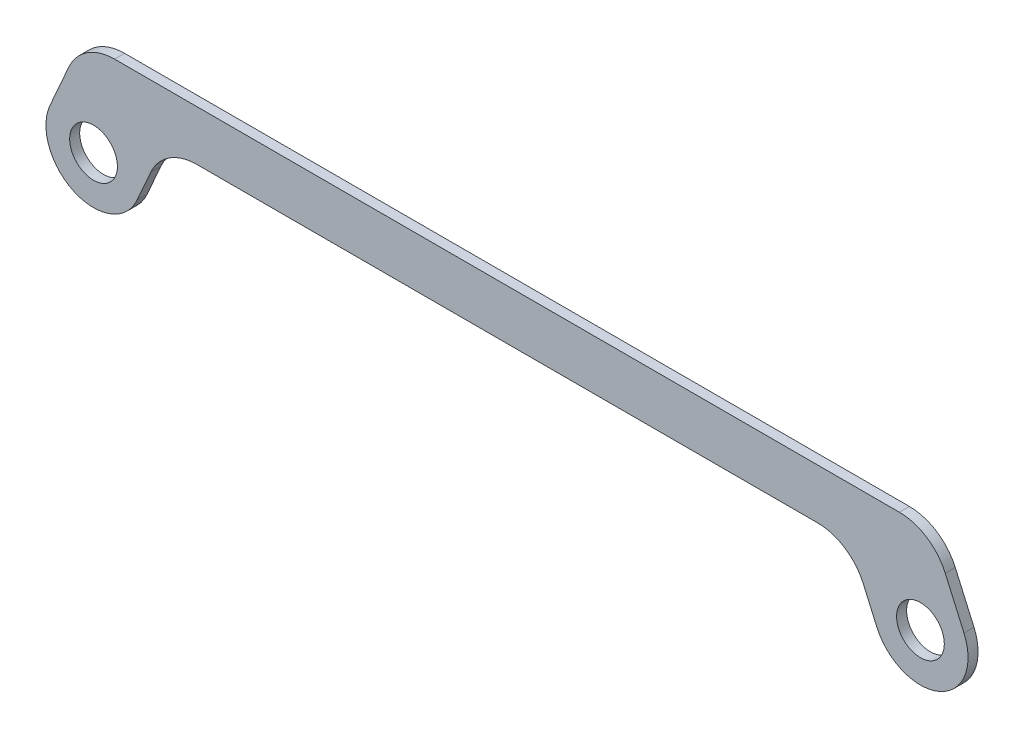
ISO-10303-21;
HEADER;
FILE_DESCRIPTION(('STEP AP214'),'2;1');
FILE_NAME('part.step','',(''),(''),'','','');
FILE_SCHEMA(('AUTOMOTIVE_DESIGN { 1 0 10303 214 1 1 1 1 }'));
ENDSEC;
DATA;
#1=APPLICATION_CONTEXT('core data for automotive mechanical design processes');
#2=APPLICATION_PROTOCOL_DEFINITION('international standard','automotive_design',2000,#1);
#3=PRODUCT_CONTEXT('',#1,'mechanical');
#4=PRODUCT('Part','Part','',(#3));
#5=PRODUCT_RELATED_PRODUCT_CATEGORY('part','',(#4));
#6=PRODUCT_DEFINITION_FORMATION('','',#4);
#7=PRODUCT_DEFINITION_CONTEXT('part definition',#1,'design');
#8=PRODUCT_DEFINITION('design','',#6,#7);
#9=PRODUCT_DEFINITION_SHAPE('','',#8);
#10=(LENGTH_UNIT() NAMED_UNIT(*) SI_UNIT(.MILLI.,.METRE.));
#11=(NAMED_UNIT(*) PLANE_ANGLE_UNIT() SI_UNIT($,.RADIAN.));
#12=(NAMED_UNIT(*) SI_UNIT($,.STERADIAN.) SOLID_ANGLE_UNIT());
#13=UNCERTAINTY_MEASURE_WITH_UNIT(LENGTH_MEASURE(1.E-05),#10,'distance_accuracy_value','');
#14=(GEOMETRIC_REPRESENTATION_CONTEXT(3) GLOBAL_UNCERTAINTY_ASSIGNED_CONTEXT((#13)) GLOBAL_UNIT_ASSIGNED_CONTEXT((#10,
#11,#12)) REPRESENTATION_CONTEXT('',''));
#15=CARTESIAN_POINT('',(0.,0.,0.));
#16=DIRECTION('',(0.,0.,1.));
#17=DIRECTION('',(1.,0.,0.));
#18=AXIS2_PLACEMENT_3D('',#15,#16,#17);
#19=CARTESIAN_POINT('',(0.,0.,4.));
#20=DIRECTION('',(0.,0.,-1.));
#21=DIRECTION('',(-1.,0.,0.));
#22=AXIS2_PLACEMENT_3D('',#19,#20,#21);
#23=PLANE('',#22);
#24=DIRECTION('',(-0.403699080087145,0.914891825702248,0.));
#25=VECTOR('',#24,1.);
#26=CARTESIAN_POINT('',(347.382944688343,7.67028252165581,4.));
#27=LINE('',#26,#25);
#28=CARTESIAN_POINT('',(347.382944688343,7.67028252165581,4.));
#29=VERTEX_POINT('',#28);
#30=CARTESIAN_POINT('',(339.902023752577,24.624082395016,4.));
#31=VERTEX_POINT('',#30);
#32=EDGE_CURVE('E205',#29,#31,#27,.T.);
#33=ORIENTED_EDGE('',*,*,#32,.T.);
#34=CARTESIAN_POINT('',(321.604187238532,16.5501007932731,4.));
#35=DIRECTION('',(0.,0.,-1.));
#36=DIRECTION('',(-1.,0.,0.));
#37=AXIS2_PLACEMENT_3D('',#34,#35,#36);
#38=CIRCLE('',#37,20.);
#39=CARTESIAN_POINT('',(321.604187238532,36.5501007932731,4.));
#40=VERTEX_POINT('',#39);
#41=EDGE_CURVE('E172',#31,#40,#38,.F.);
#42=ORIENTED_EDGE('',*,*,#41,.T.);
#43=DIRECTION('',(-1.,0.,0.));
#44=VECTOR('',#43,1.);
#45=CARTESIAN_POINT('',(-4.63962821987729,36.5501007932731,4.));
#46=LINE('',#45,#44);
#47=CARTESIAN_POINT('',(8.3958127614682,36.5501007932731,4.));
#48=VERTEX_POINT('',#47);
#49=EDGE_CURVE('E207',#40,#48,#46,.T.);
#50=ORIENTED_EDGE('',*,*,#49,.T.);
#51=CARTESIAN_POINT('',(8.3958127614682,16.5501007932731,4.));
#52=DIRECTION('',(0.,0.,-1.));
#53=DIRECTION('',(-1.,0.,0.));
#54=AXIS2_PLACEMENT_3D('',#51,#52,#53);
#55=CIRCLE('',#54,20.);
#56=CARTESIAN_POINT('',(-9.90202375257675,24.624082395016,4.));
#57=VERTEX_POINT('',#56);
#58=EDGE_CURVE('E50',#48,#57,#55,.F.);
#59=ORIENTED_EDGE('',*,*,#58,.T.);
#60=DIRECTION('',(-0.403699080087146,-0.914891825702248,0.));
#61=VECTOR('',#60,1.);
#62=CARTESIAN_POINT('',(-17.3829446883427,7.67028252165577,4.));
#63=LINE('',#62,#61);
#64=CARTESIAN_POINT('',(-17.3829446883427,7.67028252165577,4.));
#65=VERTEX_POINT('',#64);
#66=EDGE_CURVE('E136',#57,#65,#63,.T.);
#67=ORIENTED_EDGE('',*,*,#66,.T.);
#68=CARTESIAN_POINT('',(0.,0.,4.));
#69=DIRECTION('',(0.,0.,1.));
#70=DIRECTION('',(-1.,0.,0.));
#71=AXIS2_PLACEMENT_3D('',#68,#69,#70);
#72=CIRCLE('',#71,19.);
#73=CARTESIAN_POINT('',(17.3829446883427,-7.67028252165576,4.));
#74=VERTEX_POINT('',#73);
#75=EDGE_CURVE('E131',#65,#74,#72,.T.);
#76=ORIENTED_EDGE('',*,*,#75,.T.);
#77=DIRECTION('',(0.403699080087146,0.914891825702248,0.));
#78=VECTOR('',#77,1.);
#79=CARTESIAN_POINT('',(17.3829446883427,-7.67028252165576,4.));
#80=LINE('',#79,#78);
#81=CARTESIAN_POINT('',(22.8078743550893,4.62408239501599,4.));
#82=VERTEX_POINT('',#81);
#83=EDGE_CURVE('E123',#74,#82,#80,.T.);
#84=ORIENTED_EDGE('',*,*,#83,.T.);
#85=CARTESIAN_POINT('',(41.1057108691342,-3.44989920672692,4.));
#86=DIRECTION('',(0.,0.,-1.));
#87=DIRECTION('',(-1.,0.,0.));
#88=AXIS2_PLACEMENT_3D('',#85,#86,#87);
#89=CIRCLE('',#88,20.);
#90=CARTESIAN_POINT('',(41.1057108691342,16.5501007932731,4.));
#91=VERTEX_POINT('',#90);
#92=EDGE_CURVE('E11',#82,#91,#89,.T.);
#93=ORIENTED_EDGE('',*,*,#92,.T.);
#94=DIRECTION('',(1.,0.,0.));
#95=VECTOR('',#94,1.);
#96=CARTESIAN_POINT('',(28.0702698877887,16.5501007932731,4.));
#97=LINE('',#96,#95);
#98=CARTESIAN_POINT('',(288.894289130866,16.5501007932731,4.));
#99=VERTEX_POINT('',#98);
#100=EDGE_CURVE('E130',#91,#99,#97,.T.);
#101=ORIENTED_EDGE('',*,*,#100,.T.);
#102=CARTESIAN_POINT('',(288.894289130866,-3.44989920672689,4.));
#103=DIRECTION('',(0.,0.,-1.));
#104=DIRECTION('',(-1.,0.,0.));
#105=AXIS2_PLACEMENT_3D('',#102,#103,#104);
#106=CIRCLE('',#105,20.);
#107=CARTESIAN_POINT('',(307.192125644911,4.62408239501602,4.));
#108=VERTEX_POINT('',#107);
#109=EDGE_CURVE('E180',#99,#108,#106,.T.);
#110=ORIENTED_EDGE('',*,*,#109,.T.);
#111=DIRECTION('',(0.403699080087146,-0.914891825702248,0.));
#112=VECTOR('',#111,1.);
#113=CARTESIAN_POINT('',(312.617055311657,-7.67028252165573,4.));
#114=LINE('',#113,#112);
#115=CARTESIAN_POINT('',(312.617055311657,-7.67028252165574,4.));
#116=VERTEX_POINT('',#115);
#117=EDGE_CURVE('E199',#108,#116,#114,.T.);
#118=ORIENTED_EDGE('',*,*,#117,.T.);
#119=CARTESIAN_POINT('',(330.,0.,4.));
#120=DIRECTION('',(0.,0.,1.));
#121=DIRECTION('',(1.,0.,0.));
#122=AXIS2_PLACEMENT_3D('',#119,#120,#121);
#123=CIRCLE('',#122,19.);
#124=EDGE_CURVE('E201',#116,#29,#123,.T.);
#125=ORIENTED_EDGE('',*,*,#124,.T.);
#126=EDGE_LOOP('',(#33,#42,#50,#59,#67,#76,#84,#93,#101,#110,#118,#125));
#127=FACE_BOUND('',#126,.T.);
#128=CARTESIAN_POINT('',(0.,0.,4.));
#129=DIRECTION('',(0.,0.,1.));
#130=DIRECTION('',(1.,0.,0.));
#131=AXIS2_PLACEMENT_3D('',#128,#129,#130);
#132=CIRCLE('',#131,9.525);
#133=CARTESIAN_POINT('',(9.525,0.,4.));
#134=VERTEX_POINT('',#133);
#135=EDGE_CURVE('E211',#134,#134,#132,.T.);
#136=ORIENTED_EDGE('',*,*,#135,.F.);
#137=EDGE_LOOP('',(#136));
#138=FACE_BOUND('',#137,.T.);
#139=CARTESIAN_POINT('',(330.,0.,4.));
#140=DIRECTION('',(0.,0.,1.));
#141=DIRECTION('',(1.,0.,0.));
#142=AXIS2_PLACEMENT_3D('',#139,#140,#141);
#143=CIRCLE('',#142,9.52500000000002);
#144=CARTESIAN_POINT('',(339.525,0.,4.));
#145=VERTEX_POINT('',#144);
#146=EDGE_CURVE('E279',#145,#145,#143,.T.);
#147=ORIENTED_EDGE('',*,*,#146,.F.);
#148=EDGE_LOOP('',(#147));
#149=FACE_BOUND('',#148,.T.);
#150=ADVANCED_FACE('F35',(#127,#138,#149),#23,.F.);
#151=CARTESIAN_POINT('',(0.,0.,0.));
#152=DIRECTION('',(0.,0.,-1.));
#153=DIRECTION('',(-1.,0.,0.));
#154=AXIS2_PLACEMENT_3D('',#151,#152,#153);
#155=PLANE('',#154);
#156=CARTESIAN_POINT('',(0.,0.,0.));
#157=DIRECTION('',(0.,0.,1.));
#158=DIRECTION('',(1.,0.,0.));
#159=AXIS2_PLACEMENT_3D('',#156,#157,#158);
#160=CIRCLE('',#159,9.525);
#161=CARTESIAN_POINT('',(9.525,0.,0.));
#162=VERTEX_POINT('',#161);
#163=EDGE_CURVE('E284',#162,#162,#160,.T.);
#164=ORIENTED_EDGE('',*,*,#163,.T.);
#165=EDGE_LOOP('',(#164));
#166=FACE_BOUND('',#165,.T.);
#167=DIRECTION('',(-1.,0.,0.));
#168=VECTOR('',#167,1.);
#169=CARTESIAN_POINT('',(-4.63962821987729,36.5501007932731,0.));
#170=LINE('',#169,#168);
#171=CARTESIAN_POINT('',(321.604187238532,36.5501007932731,0.));
#172=VERTEX_POINT('',#171);
#173=CARTESIAN_POINT('',(8.3958127614682,36.5501007932731,0.));
#174=VERTEX_POINT('',#173);
#175=EDGE_CURVE('E221',#172,#174,#170,.T.);
#176=ORIENTED_EDGE('',*,*,#175,.F.);
#177=CARTESIAN_POINT('',(321.604187238532,16.5501007932731,0.));
#178=DIRECTION('',(0.,0.,-1.));
#179=DIRECTION('',(-1.,0.,0.));
#180=AXIS2_PLACEMENT_3D('',#177,#178,#179);
#181=CIRCLE('',#180,20.);
#182=CARTESIAN_POINT('',(339.902023752577,24.624082395016,0.));
#183=VERTEX_POINT('',#182);
#184=EDGE_CURVE('E167',#172,#183,#181,.T.);
#185=ORIENTED_EDGE('',*,*,#184,.T.);
#186=DIRECTION('',(-0.403699080087145,0.914891825702248,0.));
#187=VECTOR('',#186,1.);
#188=CARTESIAN_POINT('',(347.382944688343,7.67028252165581,0.));
#189=LINE('',#188,#187);
#190=CARTESIAN_POINT('',(347.382944688343,7.67028252165581,0.));
#191=VERTEX_POINT('',#190);
#192=EDGE_CURVE('E218',#191,#183,#189,.T.);
#193=ORIENTED_EDGE('',*,*,#192,.F.);
#194=CARTESIAN_POINT('',(330.,0.,0.));
#195=DIRECTION('',(0.,0.,1.));
#196=DIRECTION('',(1.,0.,0.));
#197=AXIS2_PLACEMENT_3D('',#194,#195,#196);
#198=CIRCLE('',#197,19.);
#199=CARTESIAN_POINT('',(312.617055311657,-7.67028252165574,0.));
#200=VERTEX_POINT('',#199);
#201=EDGE_CURVE('E216',#200,#191,#198,.T.);
#202=ORIENTED_EDGE('',*,*,#201,.F.);
#203=DIRECTION('',(0.403699080087146,-0.914891825702248,0.));
#204=VECTOR('',#203,1.);
#205=CARTESIAN_POINT('',(312.617055311657,-7.67028252165573,0.));
#206=LINE('',#205,#204);
#207=CARTESIAN_POINT('',(307.192125644911,4.62408239501602,0.));
#208=VERTEX_POINT('',#207);
#209=EDGE_CURVE('E214',#208,#200,#206,.T.);
#210=ORIENTED_EDGE('',*,*,#209,.F.);
#211=CARTESIAN_POINT('',(288.894289130866,-3.44989920672689,0.));
#212=DIRECTION('',(0.,0.,-1.));
#213=DIRECTION('',(-1.,0.,0.));
#214=AXIS2_PLACEMENT_3D('',#211,#212,#213);
#215=CIRCLE('',#214,20.);
#216=CARTESIAN_POINT('',(288.894289130866,16.5501007932731,0.));
#217=VERTEX_POINT('',#216);
#218=EDGE_CURVE('E178',#208,#217,#215,.F.);
#219=ORIENTED_EDGE('',*,*,#218,.T.);
#220=DIRECTION('',(1.,0.,0.));
#221=VECTOR('',#220,1.);
#222=CARTESIAN_POINT('',(28.0702698877887,16.5501007932731,0.));
#223=LINE('',#222,#221);
#224=CARTESIAN_POINT('',(41.1057108691342,16.5501007932731,0.));
#225=VERTEX_POINT('',#224);
#226=EDGE_CURVE('E188',#225,#217,#223,.T.);
#227=ORIENTED_EDGE('',*,*,#226,.F.);
#228=CARTESIAN_POINT('',(41.1057108691342,-3.44989920672692,0.));
#229=DIRECTION('',(0.,0.,-1.));
#230=DIRECTION('',(-1.,0.,0.));
#231=AXIS2_PLACEMENT_3D('',#228,#229,#230);
#232=CIRCLE('',#231,20.);
#233=CARTESIAN_POINT('',(22.8078743550893,4.62408239501599,0.));
#234=VERTEX_POINT('',#233);
#235=EDGE_CURVE('E43',#225,#234,#232,.F.);
#236=ORIENTED_EDGE('',*,*,#235,.T.);
#237=DIRECTION('',(0.403699080087146,0.914891825702248,0.));
#238=VECTOR('',#237,1.);
#239=CARTESIAN_POINT('',(17.3829446883427,-7.67028252165576,0.));
#240=LINE('',#239,#238);
#241=CARTESIAN_POINT('',(17.3829446883427,-7.67028252165576,0.));
#242=VERTEX_POINT('',#241);
#243=EDGE_CURVE('E186',#242,#234,#240,.T.);
#244=ORIENTED_EDGE('',*,*,#243,.F.);
#245=CARTESIAN_POINT('',(0.,0.,0.));
#246=DIRECTION('',(0.,0.,1.));
#247=DIRECTION('',(-1.,0.,0.));
#248=AXIS2_PLACEMENT_3D('',#245,#246,#247);
#249=CIRCLE('',#248,19.);
#250=CARTESIAN_POINT('',(-17.3829446883427,7.67028252165577,0.));
#251=VERTEX_POINT('',#250);
#252=EDGE_CURVE('E144',#251,#242,#249,.T.);
#253=ORIENTED_EDGE('',*,*,#252,.F.);
#254=DIRECTION('',(-0.403699080087146,-0.914891825702248,0.));
#255=VECTOR('',#254,1.);
#256=CARTESIAN_POINT('',(-17.3829446883427,7.67028252165577,0.));
#257=LINE('',#256,#255);
#258=CARTESIAN_POINT('',(-9.90202375257675,24.624082395016,0.));
#259=VERTEX_POINT('',#258);
#260=EDGE_CURVE('E140',#259,#251,#257,.T.);
#261=ORIENTED_EDGE('',*,*,#260,.F.);
#262=CARTESIAN_POINT('',(8.3958127614682,16.5501007932731,0.));
#263=DIRECTION('',(0.,0.,-1.));
#264=DIRECTION('',(-1.,0.,0.));
#265=AXIS2_PLACEMENT_3D('',#262,#263,#264);
#266=CIRCLE('',#265,20.);
#267=EDGE_CURVE('E165',#259,#174,#266,.T.);
#268=ORIENTED_EDGE('',*,*,#267,.T.);
#269=EDGE_LOOP('',(#176,#185,#193,#202,#210,#219,#227,#236,#244,#253,#261,#268));
#270=FACE_BOUND('',#269,.T.);
#271=CARTESIAN_POINT('',(330.,0.,0.));
#272=DIRECTION('',(0.,0.,1.));
#273=DIRECTION('',(1.,0.,0.));
#274=AXIS2_PLACEMENT_3D('',#271,#272,#273);
#275=CIRCLE('',#274,9.52500000000002);
#276=CARTESIAN_POINT('',(339.525,0.,0.));
#277=VERTEX_POINT('',#276);
#278=EDGE_CURVE('E282',#277,#277,#275,.T.);
#279=ORIENTED_EDGE('',*,*,#278,.T.);
#280=EDGE_LOOP('',(#279));
#281=FACE_BOUND('',#280,.T.);
#282=ADVANCED_FACE('F184',(#166,#270,#281),#155,.T.);
#283=CARTESIAN_POINT('',(0.,0.,4.));
#284=DIRECTION('',(0.,0.,-1.));
#285=DIRECTION('',(-1.,0.,0.));
#286=AXIS2_PLACEMENT_3D('',#283,#284,#285);
#287=CYLINDRICAL_SURFACE('',#286,19.);
#288=ORIENTED_EDGE('',*,*,#252,.T.);
#289=DIRECTION('',(0.,0.,-1.));
#290=VECTOR('',#289,1.);
#291=CARTESIAN_POINT('',(17.3829446883427,-7.67028252165576,4.));
#292=LINE('',#291,#290);
#293=EDGE_CURVE('E127',#74,#242,#292,.T.);
#294=ORIENTED_EDGE('',*,*,#293,.F.);
#295=ORIENTED_EDGE('',*,*,#75,.F.);
#296=DIRECTION('',(0.,0.,-1.));
#297=VECTOR('',#296,1.);
#298=CARTESIAN_POINT('',(-17.3829446883427,7.67028252165577,4.));
#299=LINE('',#298,#297);
#300=EDGE_CURVE('E210',#65,#251,#299,.T.);
#301=ORIENTED_EDGE('',*,*,#300,.T.);
#302=EDGE_LOOP('',(#288,#294,#295,#301));
#303=FACE_BOUND('',#302,.T.);
#304=ADVANCED_FACE('F142',(#303),#287,.T.);
#305=CARTESIAN_POINT('',(17.3829446883427,-7.67028252165576,4.));
#306=DIRECTION('',(-0.914891825702248,0.403699080087146,0.));
#307=DIRECTION('',(-0.403699080087146,-0.914891825702248,0.));
#308=AXIS2_PLACEMENT_3D('',#305,#306,#307);
#309=PLANE('',#308);
#310=ORIENTED_EDGE('',*,*,#243,.T.);
#311=DIRECTION('',(0.,0.,-1.));
#312=VECTOR('',#311,1.);
#313=CARTESIAN_POINT('',(22.8078743550893,4.62408239501599,4.));
#314=LINE('',#313,#312);
#315=EDGE_CURVE('E58',#234,#82,#314,.F.);
#316=ORIENTED_EDGE('',*,*,#315,.T.);
#317=ORIENTED_EDGE('',*,*,#83,.F.);
#318=ORIENTED_EDGE('',*,*,#293,.T.);
#319=EDGE_LOOP('',(#310,#316,#317,#318));
#320=FACE_BOUND('',#319,.T.);
#321=ADVANCED_FACE('F125',(#320),#309,.F.);
#322=CARTESIAN_POINT('',(28.0702698877887,16.5501007932731,4.));
#323=DIRECTION('',(0.,1.,0.));
#324=DIRECTION('',(-1.,0.,0.));
#325=AXIS2_PLACEMENT_3D('',#322,#323,#324);
#326=PLANE('',#325);
#327=ORIENTED_EDGE('',*,*,#226,.T.);
#328=DIRECTION('',(0.,0.,-1.));
#329=VECTOR('',#328,1.);
#330=CARTESIAN_POINT('',(288.894289130866,16.5501007932731,4.));
#331=LINE('',#330,#329);
#332=EDGE_CURVE('E158',#217,#99,#331,.F.);
#333=ORIENTED_EDGE('',*,*,#332,.T.);
#334=ORIENTED_EDGE('',*,*,#100,.F.);
#335=DIRECTION('',(0.,0.,-1.));
#336=VECTOR('',#335,1.);
#337=CARTESIAN_POINT('',(41.1057108691342,16.5501007932731,0.));
#338=LINE('',#337,#336);
#339=EDGE_CURVE('E149',#91,#225,#338,.T.);
#340=ORIENTED_EDGE('',*,*,#339,.T.);
#341=EDGE_LOOP('',(#327,#333,#334,#340));
#342=FACE_BOUND('',#341,.T.);
#343=ADVANCED_FACE('F197',(#342),#326,.F.);
#344=CARTESIAN_POINT('',(312.617055311657,-7.67028252165573,4.));
#345=DIRECTION('',(0.914891825702248,0.403699080087146,0.));
#346=DIRECTION('',(-0.403699080087146,0.914891825702248,0.));
#347=AXIS2_PLACEMENT_3D('',#344,#345,#346);
#348=PLANE('',#347);
#349=ORIENTED_EDGE('',*,*,#117,.F.);
#350=DIRECTION('',(0.,0.,-1.));
#351=VECTOR('',#350,1.);
#352=CARTESIAN_POINT('',(307.192125644911,4.62408239501603,0.));
#353=LINE('',#352,#351);
#354=EDGE_CURVE('E145',#108,#208,#353,.T.);
#355=ORIENTED_EDGE('',*,*,#354,.T.);
#356=ORIENTED_EDGE('',*,*,#209,.T.);
#357=DIRECTION('',(0.,0.,-1.));
#358=VECTOR('',#357,1.);
#359=CARTESIAN_POINT('',(312.617055311657,-7.67028252165574,4.));
#360=LINE('',#359,#358);
#361=EDGE_CURVE('E146',#116,#200,#360,.T.);
#362=ORIENTED_EDGE('',*,*,#361,.F.);
#363=EDGE_LOOP('',(#349,#355,#356,#362));
#364=FACE_BOUND('',#363,.T.);
#365=ADVANCED_FACE('F348',(#364),#348,.F.);
#366=CARTESIAN_POINT('',(330.,0.,4.));
#367=DIRECTION('',(0.,0.,-1.));
#368=DIRECTION('',(-1.,0.,0.));
#369=AXIS2_PLACEMENT_3D('',#366,#367,#368);
#370=CYLINDRICAL_SURFACE('',#369,19.);
#371=ORIENTED_EDGE('',*,*,#201,.T.);
#372=DIRECTION('',(0.,0.,-1.));
#373=VECTOR('',#372,1.);
#374=CARTESIAN_POINT('',(347.382944688343,7.67028252165581,4.));
#375=LINE('',#374,#373);
#376=EDGE_CURVE('E152',#29,#191,#375,.T.);
#377=ORIENTED_EDGE('',*,*,#376,.F.);
#378=ORIENTED_EDGE('',*,*,#124,.F.);
#379=ORIENTED_EDGE('',*,*,#361,.T.);
#380=EDGE_LOOP('',(#371,#377,#378,#379));
#381=FACE_BOUND('',#380,.T.);
#382=ADVANCED_FACE('F341',(#381),#370,.T.);
#383=CARTESIAN_POINT('',(347.382944688343,7.67028252165581,4.));
#384=DIRECTION('',(-0.914891825702248,-0.403699080087145,0.));
#385=DIRECTION('',(0.403699080087145,-0.914891825702248,0.));
#386=AXIS2_PLACEMENT_3D('',#383,#384,#385);
#387=PLANE('',#386);
#388=ORIENTED_EDGE('',*,*,#192,.T.);
#389=DIRECTION('',(0.,0.,-1.));
#390=VECTOR('',#389,1.);
#391=CARTESIAN_POINT('',(339.902023752577,24.624082395016,4.));
#392=LINE('',#391,#390);
#393=EDGE_CURVE('E169',#183,#31,#392,.F.);
#394=ORIENTED_EDGE('',*,*,#393,.T.);
#395=ORIENTED_EDGE('',*,*,#32,.F.);
#396=ORIENTED_EDGE('',*,*,#376,.T.);
#397=EDGE_LOOP('',(#388,#394,#395,#396));
#398=FACE_BOUND('',#397,.T.);
#399=ADVANCED_FACE('F230',(#398),#387,.F.);
#400=CARTESIAN_POINT('',(-4.63962821987729,36.5501007932731,4.));
#401=DIRECTION('',(0.,-1.,0.));
#402=DIRECTION('',(1.,0.,0.));
#403=AXIS2_PLACEMENT_3D('',#400,#401,#402);
#404=PLANE('',#403);
#405=ORIENTED_EDGE('',*,*,#49,.F.);
#406=DIRECTION('',(0.,0.,-1.));
#407=VECTOR('',#406,1.);
#408=CARTESIAN_POINT('',(321.604187238532,36.5501007932731,4.));
#409=LINE('',#408,#407);
#410=EDGE_CURVE('E162',#40,#172,#409,.T.);
#411=ORIENTED_EDGE('',*,*,#410,.T.);
#412=ORIENTED_EDGE('',*,*,#175,.T.);
#413=DIRECTION('',(0.,0.,-1.));
#414=VECTOR('',#413,1.);
#415=CARTESIAN_POINT('',(8.3958127614682,36.5501007932731,4.));
#416=LINE('',#415,#414);
#417=EDGE_CURVE('E160',#174,#48,#416,.F.);
#418=ORIENTED_EDGE('',*,*,#417,.T.);
#419=EDGE_LOOP('',(#405,#411,#412,#418));
#420=FACE_BOUND('',#419,.T.);
#421=ADVANCED_FACE('F242',(#420),#404,.F.);
#422=CARTESIAN_POINT('',(-17.3829446883427,7.67028252165577,4.));
#423=DIRECTION('',(0.914891825702248,-0.403699080087146,0.));
#424=DIRECTION('',(0.403699080087146,0.914891825702248,0.));
#425=AXIS2_PLACEMENT_3D('',#422,#423,#424);
#426=PLANE('',#425);
#427=ORIENTED_EDGE('',*,*,#66,.F.);
#428=DIRECTION('',(0.,0.,-1.));
#429=VECTOR('',#428,1.);
#430=CARTESIAN_POINT('',(-9.90202375257675,24.624082395016,4.));
#431=LINE('',#430,#429);
#432=EDGE_CURVE('E175',#57,#259,#431,.T.);
#433=ORIENTED_EDGE('',*,*,#432,.T.);
#434=ORIENTED_EDGE('',*,*,#260,.T.);
#435=ORIENTED_EDGE('',*,*,#300,.F.);
#436=EDGE_LOOP('',(#427,#433,#434,#435));
#437=FACE_BOUND('',#436,.T.);
#438=ADVANCED_FACE('F248',(#437),#426,.F.);
#439=CARTESIAN_POINT('',(0.,0.,4.));
#440=DIRECTION('',(0.,0.,-1.));
#441=DIRECTION('',(-1.,0.,0.));
#442=AXIS2_PLACEMENT_3D('',#439,#440,#441);
#443=CYLINDRICAL_SURFACE('',#442,9.525);
#444=ORIENTED_EDGE('',*,*,#135,.T.);
#445=EDGE_LOOP('',(#444));
#446=FACE_BOUND('',#445,.T.);
#447=ORIENTED_EDGE('',*,*,#163,.F.);
#448=EDGE_LOOP('',(#447));
#449=FACE_BOUND('',#448,.T.);
#450=ADVANCED_FACE('F250',(#446,#449),#443,.F.);
#451=CARTESIAN_POINT('',(330.,0.,4.));
#452=DIRECTION('',(0.,0.,-1.));
#453=DIRECTION('',(-1.,0.,0.));
#454=AXIS2_PLACEMENT_3D('',#451,#452,#453);
#455=CYLINDRICAL_SURFACE('',#454,9.52500000000002);
#456=ORIENTED_EDGE('',*,*,#146,.T.);
#457=EDGE_LOOP('',(#456));
#458=FACE_BOUND('',#457,.T.);
#459=ORIENTED_EDGE('',*,*,#278,.F.);
#460=EDGE_LOOP('',(#459));
#461=FACE_BOUND('',#460,.T.);
#462=ADVANCED_FACE('F256',(#458,#461),#455,.F.);
#463=CARTESIAN_POINT('',(288.894289130866,-3.44989920672689,4.));
#464=DIRECTION('',(0.,0.,1.));
#465=DIRECTION('',(1.,0.,0.));
#466=AXIS2_PLACEMENT_3D('',#463,#464,#465);
#467=CYLINDRICAL_SURFACE('',#466,20.);
#468=ORIENTED_EDGE('',*,*,#109,.F.);
#469=ORIENTED_EDGE('',*,*,#332,.F.);
#470=ORIENTED_EDGE('',*,*,#218,.F.);
#471=ORIENTED_EDGE('',*,*,#354,.F.);
#472=EDGE_LOOP('',(#468,#469,#470,#471));
#473=FACE_BOUND('',#472,.T.);
#474=ADVANCED_FACE('F269',(#473),#467,.F.);
#475=CARTESIAN_POINT('',(321.604187238532,16.5501007932731,4.));
#476=DIRECTION('',(0.,0.,-1.));
#477=DIRECTION('',(-1.,0.,0.));
#478=AXIS2_PLACEMENT_3D('',#475,#476,#477);
#479=CYLINDRICAL_SURFACE('',#478,20.);
#480=ORIENTED_EDGE('',*,*,#41,.F.);
#481=ORIENTED_EDGE('',*,*,#393,.F.);
#482=ORIENTED_EDGE('',*,*,#184,.F.);
#483=ORIENTED_EDGE('',*,*,#410,.F.);
#484=EDGE_LOOP('',(#480,#481,#482,#483));
#485=FACE_BOUND('',#484,.T.);
#486=ADVANCED_FACE('F239',(#485),#479,.T.);
#487=CARTESIAN_POINT('',(41.1057108691342,-3.44989920672692,4.));
#488=DIRECTION('',(0.,0.,1.));
#489=DIRECTION('',(1.,0.,0.));
#490=AXIS2_PLACEMENT_3D('',#487,#488,#489);
#491=CYLINDRICAL_SURFACE('',#490,20.);
#492=ORIENTED_EDGE('',*,*,#92,.F.);
#493=ORIENTED_EDGE('',*,*,#315,.F.);
#494=ORIENTED_EDGE('',*,*,#235,.F.);
#495=ORIENTED_EDGE('',*,*,#339,.F.);
#496=EDGE_LOOP('',(#492,#493,#494,#495));
#497=FACE_BOUND('',#496,.T.);
#498=ADVANCED_FACE('F192',(#497),#491,.F.);
#499=CARTESIAN_POINT('',(8.3958127614682,16.5501007932731,4.));
#500=DIRECTION('',(0.,0.,-1.));
#501=DIRECTION('',(-1.,0.,0.));
#502=AXIS2_PLACEMENT_3D('',#499,#500,#501);
#503=CYLINDRICAL_SURFACE('',#502,20.);
#504=ORIENTED_EDGE('',*,*,#58,.F.);
#505=ORIENTED_EDGE('',*,*,#417,.F.);
#506=ORIENTED_EDGE('',*,*,#267,.F.);
#507=ORIENTED_EDGE('',*,*,#432,.F.);
#508=EDGE_LOOP('',(#504,#505,#506,#507));
#509=FACE_BOUND('',#508,.T.);
#510=ADVANCED_FACE('F37',(#509),#503,.T.);
#511=CLOSED_SHELL('',(#150,#282,#304,#321,#343,#365,#382,#399,#421,#438,#450,#462,#474,#486,
#498,#510));
#512=MANIFOLD_SOLID_BREP('B2',#511);
#513=ADVANCED_BREP_SHAPE_REPRESENTATION('',(#18,#512),#14);
#514=SHAPE_DEFINITION_REPRESENTATION(#9,#513);
ENDSEC;
END-ISO-10303-21;
